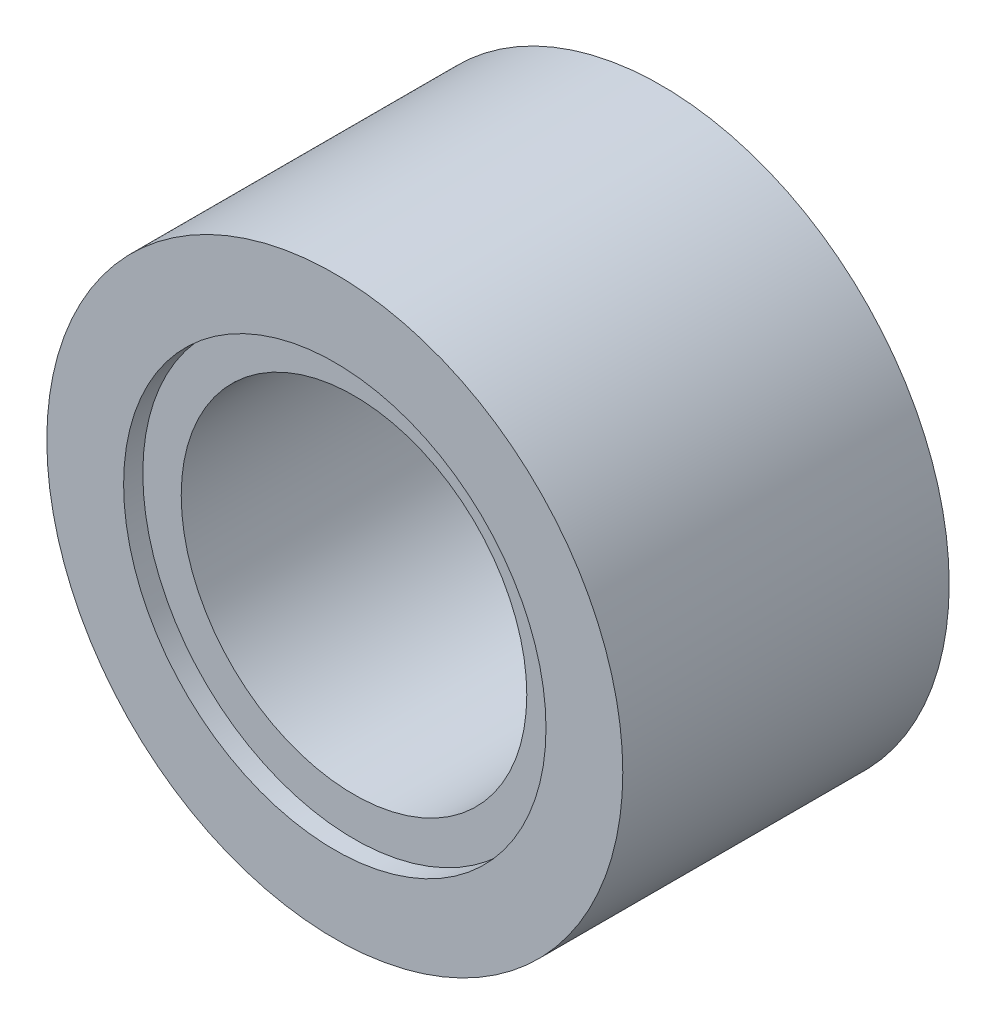
ISO-10303-21;
HEADER;
FILE_DESCRIPTION(('STEP AP214'),'2;1');
FILE_NAME('part.step','',(''),(''),'','','');
FILE_SCHEMA(('AUTOMOTIVE_DESIGN { 1 0 10303 214 1 1 1 1 }'));
ENDSEC;
DATA;
#1=APPLICATION_CONTEXT('core data for automotive mechanical design processes');
#2=APPLICATION_PROTOCOL_DEFINITION('international standard','automotive_design',2000,#1);
#3=PRODUCT_CONTEXT('',#1,'mechanical');
#4=PRODUCT('Part','Part','',(#3));
#5=PRODUCT_RELATED_PRODUCT_CATEGORY('part','',(#4));
#6=PRODUCT_DEFINITION_FORMATION('','',#4);
#7=PRODUCT_DEFINITION_CONTEXT('part definition',#1,'design');
#8=PRODUCT_DEFINITION('design','',#6,#7);
#9=PRODUCT_DEFINITION_SHAPE('','',#8);
#10=(LENGTH_UNIT() NAMED_UNIT(*) SI_UNIT(.MILLI.,.METRE.));
#11=(NAMED_UNIT(*) PLANE_ANGLE_UNIT() SI_UNIT($,.RADIAN.));
#12=(NAMED_UNIT(*) SI_UNIT($,.STERADIAN.) SOLID_ANGLE_UNIT());
#13=UNCERTAINTY_MEASURE_WITH_UNIT(LENGTH_MEASURE(1.E-05),#10,'distance_accuracy_value','');
#14=(GEOMETRIC_REPRESENTATION_CONTEXT(3) GLOBAL_UNCERTAINTY_ASSIGNED_CONTEXT((#13)) GLOBAL_UNIT_ASSIGNED_CONTEXT((#10,
#11,#12)) REPRESENTATION_CONTEXT('',''));
#15=CARTESIAN_POINT('',(0.,0.,0.));
#16=DIRECTION('',(0.,0.,1.));
#17=DIRECTION('',(1.,0.,0.));
#18=AXIS2_PLACEMENT_3D('',#15,#16,#17);
#19=CARTESIAN_POINT('',(0.,0.,34.));
#20=DIRECTION('',(0.,0.,-1.));
#21=DIRECTION('',(-1.,0.,0.));
#22=AXIS2_PLACEMENT_3D('',#19,#20,#21);
#23=CYLINDRICAL_SURFACE('',#22,30.);
#24=CARTESIAN_POINT('',(0.,0.,34.));
#25=DIRECTION('',(0.,0.,1.));
#26=DIRECTION('',(1.,0.,0.));
#27=AXIS2_PLACEMENT_3D('',#24,#25,#26);
#28=CIRCLE('',#27,30.);
#29=CARTESIAN_POINT('',(30.,0.,34.));
#30=VERTEX_POINT('',#29);
#31=EDGE_CURVE('E10',#30,#30,#28,.T.);
#32=ORIENTED_EDGE('',*,*,#31,.F.);
#33=EDGE_LOOP('',(#32));
#34=FACE_BOUND('',#33,.T.);
#35=CARTESIAN_POINT('',(0.,0.,0.));
#36=DIRECTION('',(0.,0.,1.));
#37=DIRECTION('',(1.,0.,0.));
#38=AXIS2_PLACEMENT_3D('',#35,#36,#37);
#39=CIRCLE('',#38,30.);
#40=CARTESIAN_POINT('',(30.,0.,0.));
#41=VERTEX_POINT('',#40);
#42=EDGE_CURVE('E45',#41,#41,#39,.T.);
#43=ORIENTED_EDGE('',*,*,#42,.T.);
#44=EDGE_LOOP('',(#43));
#45=FACE_BOUND('',#44,.T.);
#46=ADVANCED_FACE('F37',(#34,#45),#23,.T.);
#47=CARTESIAN_POINT('',(0.,0.,34.));
#48=DIRECTION('',(0.,0.,1.));
#49=DIRECTION('',(1.,0.,0.));
#50=AXIS2_PLACEMENT_3D('',#47,#48,#49);
#51=PLANE('',#50);
#52=CARTESIAN_POINT('',(0.,0.,34.));
#53=DIRECTION('',(0.,0.,1.));
#54=DIRECTION('',(1.,0.,0.));
#55=AXIS2_PLACEMENT_3D('',#52,#53,#54);
#56=CIRCLE('',#55,22.);
#57=CARTESIAN_POINT('',(22.,0.,34.));
#58=VERTEX_POINT('',#57);
#59=EDGE_CURVE('E56',#58,#58,#56,.T.);
#60=ORIENTED_EDGE('',*,*,#59,.F.);
#61=EDGE_LOOP('',(#60));
#62=FACE_BOUND('',#61,.T.);
#63=ORIENTED_EDGE('',*,*,#31,.T.);
#64=EDGE_LOOP('',(#63));
#65=FACE_BOUND('',#64,.T.);
#66=ADVANCED_FACE('F85',(#62,#65),#51,.T.);
#67=CARTESIAN_POINT('',(0.,0.,0.));
#68=DIRECTION('',(0.,0.,1.));
#69=DIRECTION('',(1.,0.,0.));
#70=AXIS2_PLACEMENT_3D('',#67,#68,#69);
#71=PLANE('',#70);
#72=ORIENTED_EDGE('',*,*,#42,.F.);
#73=EDGE_LOOP('',(#72));
#74=FACE_BOUND('',#73,.T.);
#75=ADVANCED_FACE('F90',(#74),#71,.F.);
#76=CARTESIAN_POINT('',(0.,0.,32.));
#77=DIRECTION('',(0.,0.,1.));
#78=DIRECTION('',(1.,0.,0.));
#79=AXIS2_PLACEMENT_3D('',#76,#77,#78);
#80=PLANE('',#79);
#81=CARTESIAN_POINT('',(0.,0.,32.));
#82=DIRECTION('',(0.,0.,1.));
#83=DIRECTION('',(1.,0.,0.));
#84=AXIS2_PLACEMENT_3D('',#81,#82,#83);
#85=CIRCLE('',#84,22.);
#86=CARTESIAN_POINT('',(22.,0.,32.));
#87=VERTEX_POINT('',#86);
#88=EDGE_CURVE('E60',#87,#87,#85,.T.);
#89=ORIENTED_EDGE('',*,*,#88,.T.);
#90=EDGE_LOOP('',(#89));
#91=FACE_BOUND('',#90,.T.);
#92=CARTESIAN_POINT('',(0.,0.,32.));
#93=DIRECTION('',(0.,0.,1.));
#94=DIRECTION('',(1.,0.,0.));
#95=AXIS2_PLACEMENT_3D('',#92,#93,#94);
#96=CIRCLE('',#95,18.);
#97=CARTESIAN_POINT('',(18.,0.,32.));
#98=VERTEX_POINT('',#97);
#99=EDGE_CURVE('E40',#98,#98,#96,.F.);
#100=ORIENTED_EDGE('',*,*,#99,.T.);
#101=EDGE_LOOP('',(#100));
#102=FACE_BOUND('',#101,.T.);
#103=ADVANCED_FACE('F69',(#91,#102),#80,.T.);
#104=CARTESIAN_POINT('',(0.,0.,32.));
#105=DIRECTION('',(0.,0.,1.));
#106=DIRECTION('',(1.,0.,0.));
#107=AXIS2_PLACEMENT_3D('',#104,#105,#106);
#108=CYLINDRICAL_SURFACE('',#107,22.);
#109=ORIENTED_EDGE('',*,*,#88,.F.);
#110=EDGE_LOOP('',(#109));
#111=FACE_BOUND('',#110,.T.);
#112=ORIENTED_EDGE('',*,*,#59,.T.);
#113=EDGE_LOOP('',(#112));
#114=FACE_BOUND('',#113,.T.);
#115=ADVANCED_FACE('F79',(#111,#114),#108,.F.);
#116=CARTESIAN_POINT('',(0.,0.,4.));
#117=DIRECTION('',(0.,0.,1.));
#118=DIRECTION('',(1.,0.,0.));
#119=AXIS2_PLACEMENT_3D('',#116,#117,#118);
#120=PLANE('',#119);
#121=CARTESIAN_POINT('',(0.,0.,4.));
#122=DIRECTION('',(0.,0.,1.));
#123=DIRECTION('',(1.,0.,0.));
#124=AXIS2_PLACEMENT_3D('',#121,#122,#123);
#125=CIRCLE('',#124,18.);
#126=CARTESIAN_POINT('',(18.,0.,4.));
#127=VERTEX_POINT('',#126);
#128=EDGE_CURVE('E51',#127,#127,#125,.T.);
#129=ORIENTED_EDGE('',*,*,#128,.T.);
#130=EDGE_LOOP('',(#129));
#131=FACE_BOUND('',#130,.T.);
#132=ADVANCED_FACE('F73',(#131),#120,.T.);
#133=CARTESIAN_POINT('',(0.,0.,4.));
#134=DIRECTION('',(0.,0.,1.));
#135=DIRECTION('',(1.,0.,0.));
#136=AXIS2_PLACEMENT_3D('',#133,#134,#135);
#137=CYLINDRICAL_SURFACE('',#136,18.);
#138=ORIENTED_EDGE('',*,*,#128,.F.);
#139=EDGE_LOOP('',(#138));
#140=FACE_BOUND('',#139,.T.);
#141=ORIENTED_EDGE('',*,*,#99,.F.);
#142=EDGE_LOOP('',(#141));
#143=FACE_BOUND('',#142,.T.);
#144=ADVANCED_FACE('F71',(#140,#143),#137,.F.);
#145=CLOSED_SHELL('',(#46,#66,#75,#103,#115,#132,#144));
#146=MANIFOLD_SOLID_BREP('B2',#145);
#147=ADVANCED_BREP_SHAPE_REPRESENTATION('',(#18,#146),#14);
#148=SHAPE_DEFINITION_REPRESENTATION(#9,#147);
ENDSEC;
END-ISO-10303-21;
